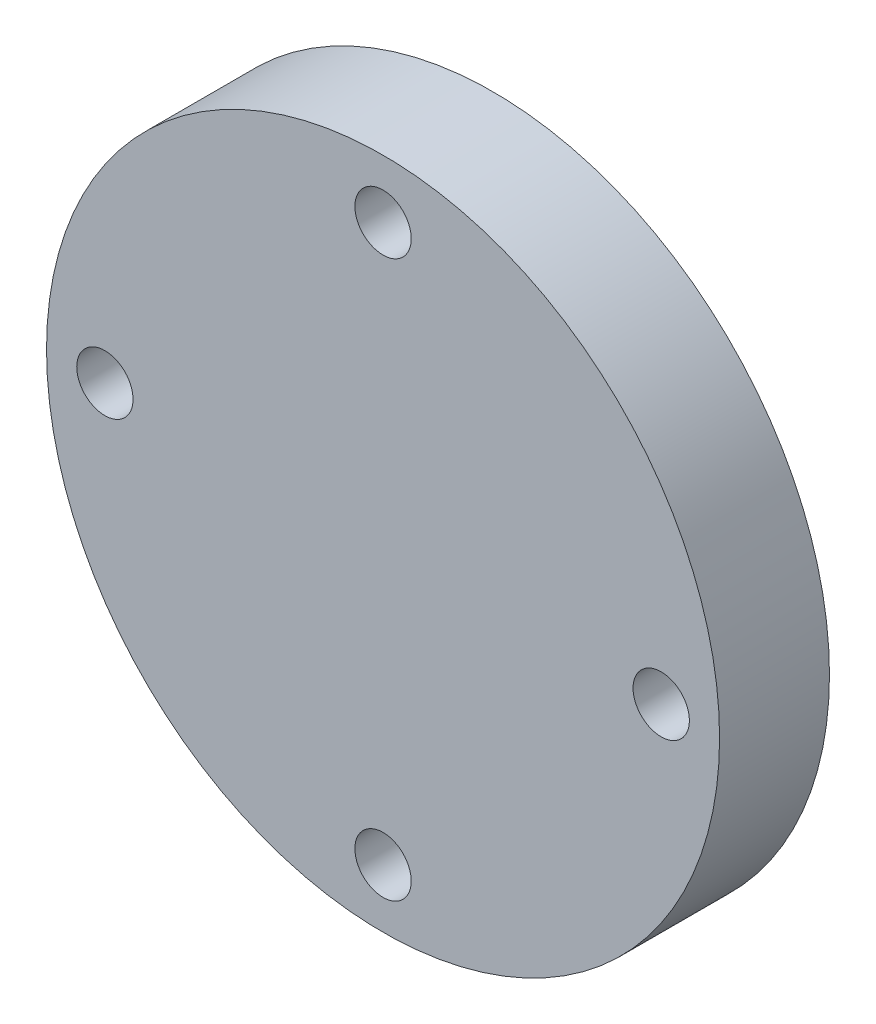
ISO-10303-21;
HEADER;
FILE_DESCRIPTION(('STEP AP214'),'2;1');
FILE_NAME('part.step','',(''),(''),'','','');
FILE_SCHEMA(('AUTOMOTIVE_DESIGN { 1 0 10303 214 1 1 1 1 }'));
ENDSEC;
DATA;
#1=APPLICATION_CONTEXT('core data for automotive mechanical design processes');
#2=APPLICATION_PROTOCOL_DEFINITION('international standard','automotive_design',2000,#1);
#3=PRODUCT_CONTEXT('',#1,'mechanical');
#4=PRODUCT('Part','Part','',(#3));
#5=PRODUCT_RELATED_PRODUCT_CATEGORY('part','',(#4));
#6=PRODUCT_DEFINITION_FORMATION('','',#4);
#7=PRODUCT_DEFINITION_CONTEXT('part definition',#1,'design');
#8=PRODUCT_DEFINITION('design','',#6,#7);
#9=PRODUCT_DEFINITION_SHAPE('','',#8);
#10=(LENGTH_UNIT() NAMED_UNIT(*) SI_UNIT(.MILLI.,.METRE.));
#11=(NAMED_UNIT(*) PLANE_ANGLE_UNIT() SI_UNIT($,.RADIAN.));
#12=(NAMED_UNIT(*) SI_UNIT($,.STERADIAN.) SOLID_ANGLE_UNIT());
#13=UNCERTAINTY_MEASURE_WITH_UNIT(LENGTH_MEASURE(1.E-05),#10,'distance_accuracy_value','');
#14=(GEOMETRIC_REPRESENTATION_CONTEXT(3) GLOBAL_UNCERTAINTY_ASSIGNED_CONTEXT((#13)) GLOBAL_UNIT_ASSIGNED_CONTEXT((#10,
#11,#12)) REPRESENTATION_CONTEXT('',''));
#15=CARTESIAN_POINT('',(0.,0.,0.));
#16=DIRECTION('',(0.,0.,1.));
#17=DIRECTION('',(1.,0.,0.));
#18=AXIS2_PLACEMENT_3D('',#15,#16,#17);
#19=CARTESIAN_POINT('',(0.,0.,0.));
#20=DIRECTION('',(0.,0.,1.));
#21=DIRECTION('',(1.,0.,0.));
#22=AXIS2_PLACEMENT_3D('',#19,#20,#21);
#23=PLANE('',#22);
#24=CARTESIAN_POINT('',(0.,20.25,0.));
#25=DIRECTION('',(0.,0.,-1.));
#26=DIRECTION('',(-1.,0.,0.));
#27=AXIS2_PLACEMENT_3D('',#24,#25,#26);
#28=CIRCLE('',#27,2.05);
#29=CARTESIAN_POINT('',(-2.05,20.25,0.));
#30=VERTEX_POINT('',#29);
#31=EDGE_CURVE('E71',#30,#30,#28,.T.);
#32=ORIENTED_EDGE('',*,*,#31,.F.);
#33=EDGE_LOOP('',(#32));
#34=FACE_BOUND('',#33,.T.);
#35=CARTESIAN_POINT('',(-20.2500000000006,5.71819751313271E-13,0.));
#36=DIRECTION('',(0.,0.,-1.));
#37=DIRECTION('',(-1.,0.,0.));
#38=AXIS2_PLACEMENT_3D('',#35,#36,#37);
#39=CIRCLE('',#38,2.05000000000045);
#40=CARTESIAN_POINT('',(-22.300000000001,5.71819751313271E-13,0.));
#41=VERTEX_POINT('',#40);
#42=EDGE_CURVE('E65',#41,#41,#39,.T.);
#43=ORIENTED_EDGE('',*,*,#42,.F.);
#44=EDGE_LOOP('',(#43));
#45=FACE_BOUND('',#44,.T.);
#46=CARTESIAN_POINT('',(-1.14363950262654E-12,-20.25,0.));
#47=DIRECTION('',(0.,0.,-1.));
#48=DIRECTION('',(-1.,0.,0.));
#49=AXIS2_PLACEMENT_3D('',#46,#47,#48);
#50=CIRCLE('',#49,2.05000000000123);
#51=CARTESIAN_POINT('',(-2.05000000000237,-20.25,0.));
#52=VERTEX_POINT('',#51);
#53=EDGE_CURVE('E59',#52,#52,#50,.T.);
#54=ORIENTED_EDGE('',*,*,#53,.F.);
#55=EDGE_LOOP('',(#54));
#56=FACE_BOUND('',#55,.T.);
#57=CARTESIAN_POINT('',(20.2499999999994,-5.74299661081544E-13,0.));
#58=DIRECTION('',(0.,0.,-1.));
#59=DIRECTION('',(-1.,0.,0.));
#60=AXIS2_PLACEMENT_3D('',#57,#58,#59);
#61=CIRCLE('',#60,2.05000000000092);
#62=CARTESIAN_POINT('',(18.1999999999985,-5.74299661081544E-13,0.));
#63=VERTEX_POINT('',#62);
#64=EDGE_CURVE('E52',#63,#63,#61,.T.);
#65=ORIENTED_EDGE('',*,*,#64,.F.);
#66=EDGE_LOOP('',(#65));
#67=FACE_BOUND('',#66,.T.);
#68=CARTESIAN_POINT('',(0.,0.,0.));
#69=DIRECTION('',(0.,0.,1.));
#70=DIRECTION('',(1.,0.,0.));
#71=AXIS2_PLACEMENT_3D('',#68,#69,#70);
#72=CIRCLE('',#71,24.5);
#73=CARTESIAN_POINT('',(24.5,0.,0.));
#74=VERTEX_POINT('',#73);
#75=EDGE_CURVE('E10',#74,#74,#72,.T.);
#76=ORIENTED_EDGE('',*,*,#75,.F.);
#77=EDGE_LOOP('',(#76));
#78=FACE_BOUND('',#77,.T.);
#79=CARTESIAN_POINT('',(0.,0.,0.));
#80=DIRECTION('',(0.,0.,1.));
#81=DIRECTION('',(1.,0.,0.));
#82=AXIS2_PLACEMENT_3D('',#79,#80,#81);
#83=CIRCLE('',#82,16.);
#84=CARTESIAN_POINT('',(16.,0.,0.));
#85=VERTEX_POINT('',#84);
#86=EDGE_CURVE('E38',#85,#85,#83,.T.);
#87=ORIENTED_EDGE('',*,*,#86,.T.);
#88=EDGE_LOOP('',(#87));
#89=FACE_BOUND('',#88,.T.);
#90=ADVANCED_FACE('F31',(#34,#45,#56,#67,#78,#89),#23,.F.);
#91=CARTESIAN_POINT('',(0.,0.,3.));
#92=DIRECTION('',(0.,0.,-1.));
#93=DIRECTION('',(-1.,0.,0.));
#94=AXIS2_PLACEMENT_3D('',#91,#92,#93);
#95=CYLINDRICAL_SURFACE('',#94,24.5);
#96=ORIENTED_EDGE('',*,*,#75,.T.);
#97=EDGE_LOOP('',(#96));
#98=FACE_BOUND('',#97,.T.);
#99=CARTESIAN_POINT('',(0.,0.,8.));
#100=DIRECTION('',(0.,0.,1.));
#101=DIRECTION('',(1.,0.,0.));
#102=AXIS2_PLACEMENT_3D('',#99,#100,#101);
#103=CIRCLE('',#102,24.5);
#104=CARTESIAN_POINT('',(24.5,0.,8.));
#105=VERTEX_POINT('',#104);
#106=EDGE_CURVE('E46',#105,#105,#103,.T.);
#107=ORIENTED_EDGE('',*,*,#106,.F.);
#108=EDGE_LOOP('',(#107));
#109=FACE_BOUND('',#108,.T.);
#110=ADVANCED_FACE('F33',(#98,#109),#95,.T.);
#111=CARTESIAN_POINT('',(0.,0.,3.));
#112=DIRECTION('',(0.,0.,-1.));
#113=DIRECTION('',(-1.,0.,0.));
#114=AXIS2_PLACEMENT_3D('',#111,#112,#113);
#115=CYLINDRICAL_SURFACE('',#114,16.);
#116=CARTESIAN_POINT('',(0.,0.,3.));
#117=DIRECTION('',(0.,0.,1.));
#118=DIRECTION('',(1.,0.,0.));
#119=AXIS2_PLACEMENT_3D('',#116,#117,#118);
#120=CIRCLE('',#119,16.);
#121=CARTESIAN_POINT('',(16.,0.,3.));
#122=VERTEX_POINT('',#121);
#123=EDGE_CURVE('E42',#122,#122,#120,.T.);
#124=ORIENTED_EDGE('',*,*,#123,.T.);
#125=EDGE_LOOP('',(#124));
#126=FACE_BOUND('',#125,.T.);
#127=ORIENTED_EDGE('',*,*,#86,.F.);
#128=EDGE_LOOP('',(#127));
#129=FACE_BOUND('',#128,.T.);
#130=ADVANCED_FACE('F95',(#126,#129),#115,.F.);
#131=CARTESIAN_POINT('',(0.,0.,3.));
#132=DIRECTION('',(0.,0.,1.));
#133=DIRECTION('',(1.,0.,0.));
#134=AXIS2_PLACEMENT_3D('',#131,#132,#133);
#135=PLANE('',#134);
#136=CARTESIAN_POINT('',(0.,0.,3.));
#137=DIRECTION('',(0.,0.,-1.));
#138=DIRECTION('',(-1.,0.,0.));
#139=AXIS2_PLACEMENT_3D('',#136,#137,#138);
#140=CIRCLE('',#139,1.5);
#141=CARTESIAN_POINT('',(-1.5,0.,3.));
#142=VERTEX_POINT('',#141);
#143=EDGE_CURVE('E76',#142,#142,#140,.T.);
#144=ORIENTED_EDGE('',*,*,#143,.F.);
#145=EDGE_LOOP('',(#144));
#146=FACE_BOUND('',#145,.T.);
#147=ORIENTED_EDGE('',*,*,#123,.F.);
#148=EDGE_LOOP('',(#147));
#149=FACE_BOUND('',#148,.T.);
#150=ADVANCED_FACE('F91',(#146,#149),#135,.F.);
#151=CARTESIAN_POINT('',(0.,0.,8.));
#152=DIRECTION('',(0.,0.,1.));
#153=DIRECTION('',(1.,0.,0.));
#154=AXIS2_PLACEMENT_3D('',#151,#152,#153);
#155=PLANE('',#154);
#156=CARTESIAN_POINT('',(0.,20.25,8.));
#157=DIRECTION('',(0.,0.,-1.));
#158=DIRECTION('',(-1.,0.,0.));
#159=AXIS2_PLACEMENT_3D('',#156,#157,#158);
#160=CIRCLE('',#159,2.05);
#161=CARTESIAN_POINT('',(-2.05,20.25,8.));
#162=VERTEX_POINT('',#161);
#163=EDGE_CURVE('E51',#162,#162,#160,.T.);
#164=ORIENTED_EDGE('',*,*,#163,.T.);
#165=EDGE_LOOP('',(#164));
#166=FACE_BOUND('',#165,.T.);
#167=CARTESIAN_POINT('',(-20.2500000000006,5.71819751313271E-13,8.));
#168=DIRECTION('',(0.,0.,-1.));
#169=DIRECTION('',(-1.,0.,0.));
#170=AXIS2_PLACEMENT_3D('',#167,#168,#169);
#171=CIRCLE('',#170,2.05000000000045);
#172=CARTESIAN_POINT('',(-22.300000000001,5.71819751313271E-13,8.));
#173=VERTEX_POINT('',#172);
#174=EDGE_CURVE('E68',#173,#173,#171,.T.);
#175=ORIENTED_EDGE('',*,*,#174,.T.);
#176=EDGE_LOOP('',(#175));
#177=FACE_BOUND('',#176,.T.);
#178=CARTESIAN_POINT('',(-1.14363950262654E-12,-20.25,8.));
#179=DIRECTION('',(0.,0.,-1.));
#180=DIRECTION('',(-1.,0.,0.));
#181=AXIS2_PLACEMENT_3D('',#178,#179,#180);
#182=CIRCLE('',#181,2.05000000000123);
#183=CARTESIAN_POINT('',(-2.05000000000237,-20.25,8.));
#184=VERTEX_POINT('',#183);
#185=EDGE_CURVE('E62',#184,#184,#182,.T.);
#186=ORIENTED_EDGE('',*,*,#185,.T.);
#187=EDGE_LOOP('',(#186));
#188=FACE_BOUND('',#187,.T.);
#189=CARTESIAN_POINT('',(20.2499999999994,-5.74299661081544E-13,8.));
#190=DIRECTION('',(0.,0.,-1.));
#191=DIRECTION('',(-1.,0.,0.));
#192=AXIS2_PLACEMENT_3D('',#189,#190,#191);
#193=CIRCLE('',#192,2.05000000000092);
#194=CARTESIAN_POINT('',(18.1999999999985,-5.74299661081544E-13,8.));
#195=VERTEX_POINT('',#194);
#196=EDGE_CURVE('E55',#195,#195,#193,.T.);
#197=ORIENTED_EDGE('',*,*,#196,.T.);
#198=EDGE_LOOP('',(#197));
#199=FACE_BOUND('',#198,.T.);
#200=ORIENTED_EDGE('',*,*,#106,.T.);
#201=EDGE_LOOP('',(#200));
#202=FACE_BOUND('',#201,.T.);
#203=ADVANCED_FACE('F94',(#166,#177,#188,#199,#202),#155,.T.);
#204=CARTESIAN_POINT('',(20.2499999999994,-5.74299661081544E-13,8.));
#205=DIRECTION('',(0.,0.,-1.));
#206=DIRECTION('',(-1.,0.,0.));
#207=AXIS2_PLACEMENT_3D('',#204,#205,#206);
#208=CYLINDRICAL_SURFACE('',#207,2.05000000000092);
#209=ORIENTED_EDGE('',*,*,#196,.F.);
#210=EDGE_LOOP('',(#209));
#211=FACE_BOUND('',#210,.T.);
#212=ORIENTED_EDGE('',*,*,#64,.T.);
#213=EDGE_LOOP('',(#212));
#214=FACE_BOUND('',#213,.T.);
#215=ADVANCED_FACE('F118',(#211,#214),#208,.F.);
#216=CARTESIAN_POINT('',(-1.14363950262654E-12,-20.25,8.));
#217=DIRECTION('',(0.,0.,-1.));
#218=DIRECTION('',(-1.,0.,0.));
#219=AXIS2_PLACEMENT_3D('',#216,#217,#218);
#220=CYLINDRICAL_SURFACE('',#219,2.05000000000123);
#221=ORIENTED_EDGE('',*,*,#185,.F.);
#222=EDGE_LOOP('',(#221));
#223=FACE_BOUND('',#222,.T.);
#224=ORIENTED_EDGE('',*,*,#53,.T.);
#225=EDGE_LOOP('',(#224));
#226=FACE_BOUND('',#225,.T.);
#227=ADVANCED_FACE('F120',(#223,#226),#220,.F.);
#228=CARTESIAN_POINT('',(-20.2500000000006,5.71819751313271E-13,8.));
#229=DIRECTION('',(0.,0.,-1.));
#230=DIRECTION('',(-1.,0.,0.));
#231=AXIS2_PLACEMENT_3D('',#228,#229,#230);
#232=CYLINDRICAL_SURFACE('',#231,2.05000000000045);
#233=ORIENTED_EDGE('',*,*,#174,.F.);
#234=EDGE_LOOP('',(#233));
#235=FACE_BOUND('',#234,.T.);
#236=ORIENTED_EDGE('',*,*,#42,.T.);
#237=EDGE_LOOP('',(#236));
#238=FACE_BOUND('',#237,.T.);
#239=ADVANCED_FACE('F127',(#235,#238),#232,.F.);
#240=CARTESIAN_POINT('',(0.,20.25,8.));
#241=DIRECTION('',(0.,0.,-1.));
#242=DIRECTION('',(-1.,0.,0.));
#243=AXIS2_PLACEMENT_3D('',#240,#241,#242);
#244=CYLINDRICAL_SURFACE('',#243,2.05);
#245=ORIENTED_EDGE('',*,*,#163,.F.);
#246=EDGE_LOOP('',(#245));
#247=FACE_BOUND('',#246,.T.);
#248=ORIENTED_EDGE('',*,*,#31,.T.);
#249=EDGE_LOOP('',(#248));
#250=FACE_BOUND('',#249,.T.);
#251=ADVANCED_FACE('F87',(#247,#250),#244,.F.);
#252=CARTESIAN_POINT('',(0.,0.,6.));
#253=DIRECTION('',(0.,0.,-1.));
#254=DIRECTION('',(-1.,0.,0.));
#255=AXIS2_PLACEMENT_3D('',#252,#253,#254);
#256=CYLINDRICAL_SURFACE('',#255,1.5);
#257=CARTESIAN_POINT('',(0.,0.,6.));
#258=DIRECTION('',(0.,0.,-1.));
#259=DIRECTION('',(-1.,0.,0.));
#260=AXIS2_PLACEMENT_3D('',#257,#258,#259);
#261=CIRCLE('',#260,1.5);
#262=CARTESIAN_POINT('',(-1.5,0.,6.));
#263=VERTEX_POINT('',#262);
#264=EDGE_CURVE('E56',#263,#263,#261,.T.);
#265=ORIENTED_EDGE('',*,*,#264,.F.);
#266=EDGE_LOOP('',(#265));
#267=FACE_BOUND('',#266,.T.);
#268=ORIENTED_EDGE('',*,*,#143,.T.);
#269=EDGE_LOOP('',(#268));
#270=FACE_BOUND('',#269,.T.);
#271=ADVANCED_FACE('F84',(#267,#270),#256,.F.);
#272=CARTESIAN_POINT('',(0.,0.,6.));
#273=DIRECTION('',(0.,0.,-1.));
#274=DIRECTION('',(-1.,0.,0.));
#275=AXIS2_PLACEMENT_3D('',#272,#273,#274);
#276=PLANE('',#275);
#277=ORIENTED_EDGE('',*,*,#264,.T.);
#278=EDGE_LOOP('',(#277));
#279=FACE_BOUND('',#278,.T.);
#280=ADVANCED_FACE('F82',(#279),#276,.T.);
#281=CLOSED_SHELL('',(#90,#110,#130,#150,#203,#215,#227,#239,#251,#271,#280));
#282=MANIFOLD_SOLID_BREP('B2',#281);
#283=ADVANCED_BREP_SHAPE_REPRESENTATION('',(#18,#282),#14);
#284=SHAPE_DEFINITION_REPRESENTATION(#9,#283);
ENDSEC;
END-ISO-10303-21;
